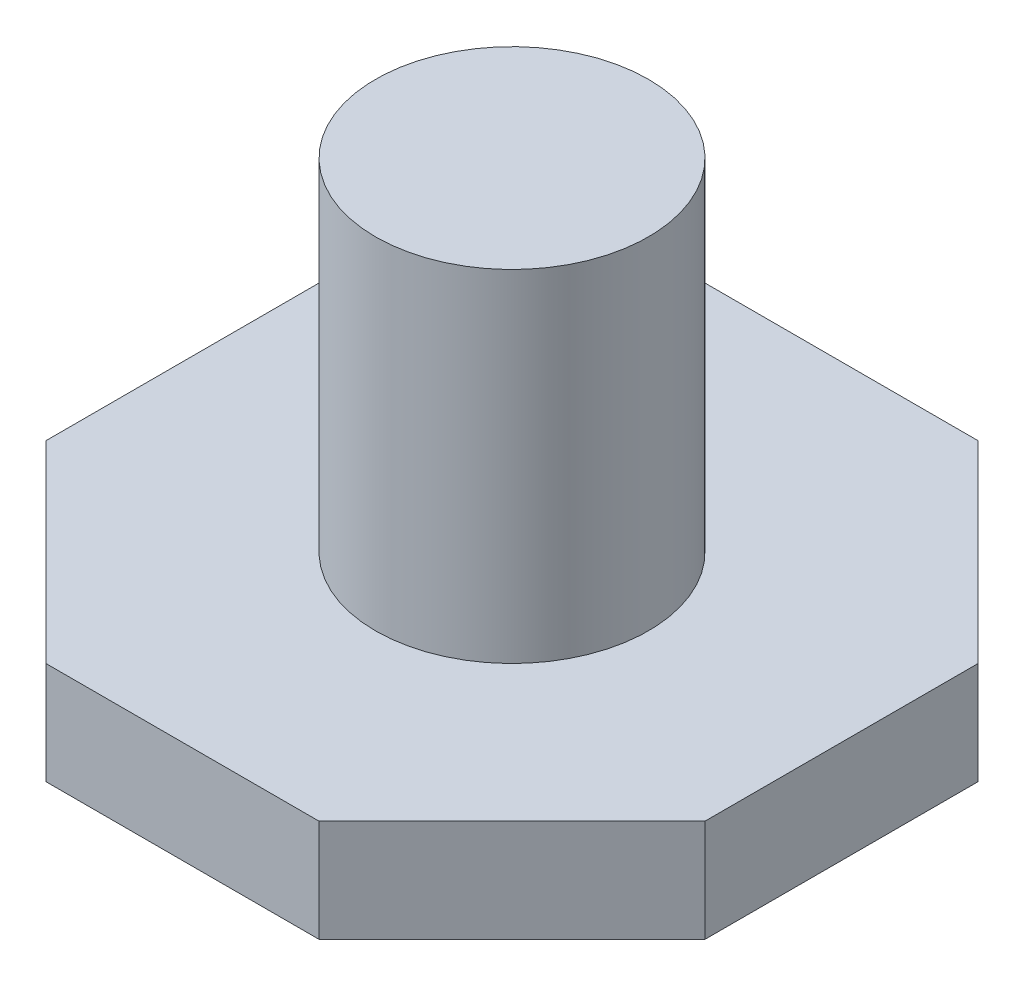
ISO-10303-21;
HEADER;
FILE_DESCRIPTION(('STEP AP214'),'2;1');
FILE_NAME('part.step','',(''),(''),'','','');
FILE_SCHEMA(('AUTOMOTIVE_DESIGN { 1 0 10303 214 1 1 1 1 }'));
ENDSEC;
DATA;
#1=APPLICATION_CONTEXT('core data for automotive mechanical design processes');
#2=APPLICATION_PROTOCOL_DEFINITION('international standard','automotive_design',2000,#1);
#3=PRODUCT_CONTEXT('',#1,'mechanical');
#4=PRODUCT('Part','Part','',(#3));
#5=PRODUCT_RELATED_PRODUCT_CATEGORY('part','',(#4));
#6=PRODUCT_DEFINITION_FORMATION('','',#4);
#7=PRODUCT_DEFINITION_CONTEXT('part definition',#1,'design');
#8=PRODUCT_DEFINITION('design','',#6,#7);
#9=PRODUCT_DEFINITION_SHAPE('','',#8);
#10=(LENGTH_UNIT() NAMED_UNIT(*) SI_UNIT(.MILLI.,.METRE.));
#11=(NAMED_UNIT(*) PLANE_ANGLE_UNIT() SI_UNIT($,.RADIAN.));
#12=(NAMED_UNIT(*) SI_UNIT($,.STERADIAN.) SOLID_ANGLE_UNIT());
#13=UNCERTAINTY_MEASURE_WITH_UNIT(LENGTH_MEASURE(1.E-05),#10,'distance_accuracy_value','');
#14=(GEOMETRIC_REPRESENTATION_CONTEXT(3) GLOBAL_UNCERTAINTY_ASSIGNED_CONTEXT((#13)) GLOBAL_UNIT_ASSIGNED_CONTEXT((#10,
#11,#12)) REPRESENTATION_CONTEXT('',''));
#15=CARTESIAN_POINT('',(0.,0.,0.));
#16=DIRECTION('',(0.,0.,1.));
#17=DIRECTION('',(1.,0.,0.));
#18=AXIS2_PLACEMENT_3D('',#15,#16,#17);
#19=CARTESIAN_POINT('',(4.82842712474619,-1.5,0.));
#20=DIRECTION('',(1.,0.,0.));
#21=DIRECTION('',(0.,0.,-1.));
#22=AXIS2_PLACEMENT_3D('',#19,#20,#21);
#23=PLANE('',#22);
#24=DIRECTION('',(0.,0.,-1.));
#25=VECTOR('',#24,1.);
#26=CARTESIAN_POINT('',(4.82842712474619,0.,0.));
#27=LINE('',#26,#25);
#28=CARTESIAN_POINT('',(4.82842712474619,0.,2.));
#29=VERTEX_POINT('',#28);
#30=CARTESIAN_POINT('',(4.82842712474619,0.,-2.));
#31=VERTEX_POINT('',#30);
#32=EDGE_CURVE('E134',#29,#31,#27,.T.);
#33=ORIENTED_EDGE('',*,*,#32,.F.);
#34=DIRECTION('',(0.,1.,0.));
#35=VECTOR('',#34,1.);
#36=CARTESIAN_POINT('',(4.82842712474619,-1.5,2.));
#37=LINE('',#36,#35);
#38=CARTESIAN_POINT('',(4.82842712474619,-1.5,2.));
#39=VERTEX_POINT('',#38);
#40=EDGE_CURVE('E44',#39,#29,#37,.T.);
#41=ORIENTED_EDGE('',*,*,#40,.F.);
#42=DIRECTION('',(0.,0.,-1.));
#43=VECTOR('',#42,1.);
#44=CARTESIAN_POINT('',(4.82842712474619,-1.5,0.));
#45=LINE('',#44,#43);
#46=CARTESIAN_POINT('',(4.82842712474619,-1.5,-2.));
#47=VERTEX_POINT('',#46);
#48=EDGE_CURVE('E156',#39,#47,#45,.T.);
#49=ORIENTED_EDGE('',*,*,#48,.T.);
#50=DIRECTION('',(0.,1.,0.));
#51=VECTOR('',#50,1.);
#52=CARTESIAN_POINT('',(4.82842712474619,-1.5,-2.));
#53=LINE('',#52,#51);
#54=EDGE_CURVE('E38',#47,#31,#53,.T.);
#55=ORIENTED_EDGE('',*,*,#54,.T.);
#56=EDGE_LOOP('',(#33,#41,#49,#55));
#57=FACE_BOUND('',#56,.T.);
#58=ADVANCED_FACE('F35',(#57),#23,.T.);
#59=CARTESIAN_POINT('',(3.4142135623731,-1.5,3.4142135623731));
#60=DIRECTION('',(0.707106781186547,0.,0.707106781186548));
#61=DIRECTION('',(0.707106781186548,0.,-0.707106781186547));
#62=AXIS2_PLACEMENT_3D('',#59,#60,#61);
#63=PLANE('',#62);
#64=DIRECTION('',(0.707106781186548,0.,-0.707106781186547));
#65=VECTOR('',#64,1.);
#66=CARTESIAN_POINT('',(3.4142135623731,0.,3.4142135623731));
#67=LINE('',#66,#65);
#68=CARTESIAN_POINT('',(2.,0.,4.82842712474619));
#69=VERTEX_POINT('',#68);
#70=EDGE_CURVE('E153',#69,#29,#67,.T.);
#71=ORIENTED_EDGE('',*,*,#70,.F.);
#72=DIRECTION('',(0.,1.,0.));
#73=VECTOR('',#72,1.);
#74=CARTESIAN_POINT('',(2.,-1.5,4.82842712474619));
#75=LINE('',#74,#73);
#76=CARTESIAN_POINT('',(2.,-1.5,4.82842712474619));
#77=VERTEX_POINT('',#76);
#78=EDGE_CURVE('E81',#77,#69,#75,.T.);
#79=ORIENTED_EDGE('',*,*,#78,.F.);
#80=DIRECTION('',(0.707106781186548,0.,-0.707106781186547));
#81=VECTOR('',#80,1.);
#82=CARTESIAN_POINT('',(3.4142135623731,-1.5,3.4142135623731));
#83=LINE('',#82,#81);
#84=EDGE_CURVE('E124',#77,#39,#83,.T.);
#85=ORIENTED_EDGE('',*,*,#84,.T.);
#86=ORIENTED_EDGE('',*,*,#40,.T.);
#87=EDGE_LOOP('',(#71,#79,#85,#86));
#88=FACE_BOUND('',#87,.T.);
#89=ADVANCED_FACE('F168',(#88),#63,.T.);
#90=CARTESIAN_POINT('',(0.,-1.5,4.82842712474619));
#91=DIRECTION('',(0.,0.,1.));
#92=DIRECTION('',(1.,0.,0.));
#93=AXIS2_PLACEMENT_3D('',#90,#91,#92);
#94=PLANE('',#93);
#95=DIRECTION('',(1.,0.,0.));
#96=VECTOR('',#95,1.);
#97=CARTESIAN_POINT('',(0.,0.,4.82842712474619));
#98=LINE('',#97,#96);
#99=CARTESIAN_POINT('',(-2.,0.,4.82842712474619));
#100=VERTEX_POINT('',#99);
#101=EDGE_CURVE('E111',#100,#69,#98,.T.);
#102=ORIENTED_EDGE('',*,*,#101,.F.);
#103=DIRECTION('',(0.,1.,0.));
#104=VECTOR('',#103,1.);
#105=CARTESIAN_POINT('',(-2.,-1.5,4.82842712474619));
#106=LINE('',#105,#104);
#107=CARTESIAN_POINT('',(-2.,-1.5,4.82842712474619));
#108=VERTEX_POINT('',#107);
#109=EDGE_CURVE('E106',#108,#100,#106,.T.);
#110=ORIENTED_EDGE('',*,*,#109,.F.);
#111=DIRECTION('',(1.,0.,0.));
#112=VECTOR('',#111,1.);
#113=CARTESIAN_POINT('',(0.,-1.5,4.82842712474619));
#114=LINE('',#113,#112);
#115=EDGE_CURVE('E109',#108,#77,#114,.T.);
#116=ORIENTED_EDGE('',*,*,#115,.T.);
#117=ORIENTED_EDGE('',*,*,#78,.T.);
#118=EDGE_LOOP('',(#102,#110,#116,#117));
#119=FACE_BOUND('',#118,.T.);
#120=ADVANCED_FACE('F108',(#119),#94,.T.);
#121=CARTESIAN_POINT('',(-3.4142135623731,-1.5,3.41421356237309));
#122=DIRECTION('',(-0.707106781186548,0.,0.707106781186547));
#123=DIRECTION('',(0.707106781186547,0.,0.707106781186548));
#124=AXIS2_PLACEMENT_3D('',#121,#122,#123);
#125=PLANE('',#124);
#126=DIRECTION('',(0.707106781186547,0.,0.707106781186548));
#127=VECTOR('',#126,1.);
#128=CARTESIAN_POINT('',(-3.4142135623731,0.,3.41421356237309));
#129=LINE('',#128,#127);
#130=CARTESIAN_POINT('',(-4.82842712474619,0.,2.));
#131=VERTEX_POINT('',#130);
#132=EDGE_CURVE('E150',#131,#100,#129,.T.);
#133=ORIENTED_EDGE('',*,*,#132,.F.);
#134=DIRECTION('',(0.,1.,0.));
#135=VECTOR('',#134,1.);
#136=CARTESIAN_POINT('',(-4.82842712474619,-1.5,2.));
#137=LINE('',#136,#135);
#138=CARTESIAN_POINT('',(-4.82842712474619,-1.5,2.));
#139=VERTEX_POINT('',#138);
#140=EDGE_CURVE('E116',#139,#131,#137,.T.);
#141=ORIENTED_EDGE('',*,*,#140,.F.);
#142=DIRECTION('',(0.707106781186547,0.,0.707106781186548));
#143=VECTOR('',#142,1.);
#144=CARTESIAN_POINT('',(-3.4142135623731,-1.5,3.41421356237309));
#145=LINE('',#144,#143);
#146=EDGE_CURVE('E122',#139,#108,#145,.T.);
#147=ORIENTED_EDGE('',*,*,#146,.T.);
#148=ORIENTED_EDGE('',*,*,#109,.T.);
#149=EDGE_LOOP('',(#133,#141,#147,#148));
#150=FACE_BOUND('',#149,.T.);
#151=ADVANCED_FACE('F126',(#150),#125,.T.);
#152=CARTESIAN_POINT('',(-4.82842712474619,-1.5,0.));
#153=DIRECTION('',(-1.,0.,0.));
#154=DIRECTION('',(0.,0.,1.));
#155=AXIS2_PLACEMENT_3D('',#152,#153,#154);
#156=PLANE('',#155);
#157=DIRECTION('',(0.,0.,1.));
#158=VECTOR('',#157,1.);
#159=CARTESIAN_POINT('',(-4.82842712474619,0.,0.));
#160=LINE('',#159,#158);
#161=CARTESIAN_POINT('',(-4.82842712474619,0.,-2.));
#162=VERTEX_POINT('',#161);
#163=EDGE_CURVE('E147',#162,#131,#160,.T.);
#164=ORIENTED_EDGE('',*,*,#163,.F.);
#165=DIRECTION('',(0.,1.,0.));
#166=VECTOR('',#165,1.);
#167=CARTESIAN_POINT('',(-4.82842712474619,-1.5,-2.));
#168=LINE('',#167,#166);
#169=CARTESIAN_POINT('',(-4.82842712474619,-1.5,-2.));
#170=VERTEX_POINT('',#169);
#171=EDGE_CURVE('E160',#170,#162,#168,.T.);
#172=ORIENTED_EDGE('',*,*,#171,.F.);
#173=DIRECTION('',(0.,0.,1.));
#174=VECTOR('',#173,1.);
#175=CARTESIAN_POINT('',(-4.82842712474619,-1.5,0.));
#176=LINE('',#175,#174);
#177=EDGE_CURVE('E127',#170,#139,#176,.T.);
#178=ORIENTED_EDGE('',*,*,#177,.T.);
#179=ORIENTED_EDGE('',*,*,#140,.T.);
#180=EDGE_LOOP('',(#164,#172,#178,#179));
#181=FACE_BOUND('',#180,.T.);
#182=ADVANCED_FACE('F181',(#181),#156,.T.);
#183=CARTESIAN_POINT('',(-3.41421356237309,-1.5,-3.41421356237309));
#184=DIRECTION('',(-0.707106781186547,0.,-0.707106781186548));
#185=DIRECTION('',(-0.707106781186548,0.,0.707106781186547));
#186=AXIS2_PLACEMENT_3D('',#183,#184,#185);
#187=PLANE('',#186);
#188=DIRECTION('',(-0.707106781186548,0.,0.707106781186547));
#189=VECTOR('',#188,1.);
#190=CARTESIAN_POINT('',(-3.41421356237309,0.,-3.41421356237309));
#191=LINE('',#190,#189);
#192=CARTESIAN_POINT('',(-2.,0.,-4.82842712474619));
#193=VERTEX_POINT('',#192);
#194=EDGE_CURVE('E144',#193,#162,#191,.T.);
#195=ORIENTED_EDGE('',*,*,#194,.F.);
#196=DIRECTION('',(0.,1.,0.));
#197=VECTOR('',#196,1.);
#198=CARTESIAN_POINT('',(-2.,-1.5,-4.82842712474619));
#199=LINE('',#198,#197);
#200=CARTESIAN_POINT('',(-2.,-1.5,-4.82842712474619));
#201=VERTEX_POINT('',#200);
#202=EDGE_CURVE('E162',#201,#193,#199,.T.);
#203=ORIENTED_EDGE('',*,*,#202,.F.);
#204=DIRECTION('',(-0.707106781186548,0.,0.707106781186547));
#205=VECTOR('',#204,1.);
#206=CARTESIAN_POINT('',(-3.41421356237309,-1.5,-3.41421356237309));
#207=LINE('',#206,#205);
#208=EDGE_CURVE('E129',#201,#170,#207,.T.);
#209=ORIENTED_EDGE('',*,*,#208,.T.);
#210=ORIENTED_EDGE('',*,*,#171,.T.);
#211=EDGE_LOOP('',(#195,#203,#209,#210));
#212=FACE_BOUND('',#211,.T.);
#213=ADVANCED_FACE('F184',(#212),#187,.T.);
#214=CARTESIAN_POINT('',(0.,-1.5,-4.82842712474619));
#215=DIRECTION('',(0.,0.,-1.));
#216=DIRECTION('',(-1.,0.,0.));
#217=AXIS2_PLACEMENT_3D('',#214,#215,#216);
#218=PLANE('',#217);
#219=DIRECTION('',(-1.,0.,0.));
#220=VECTOR('',#219,1.);
#221=CARTESIAN_POINT('',(0.,0.,-4.82842712474619));
#222=LINE('',#221,#220);
#223=CARTESIAN_POINT('',(2.,0.,-4.82842712474619));
#224=VERTEX_POINT('',#223);
#225=EDGE_CURVE('E141',#224,#193,#222,.T.);
#226=ORIENTED_EDGE('',*,*,#225,.F.);
#227=DIRECTION('',(0.,1.,0.));
#228=VECTOR('',#227,1.);
#229=CARTESIAN_POINT('',(2.,-1.5,-4.82842712474619));
#230=LINE('',#229,#228);
#231=CARTESIAN_POINT('',(2.,-1.5,-4.82842712474619));
#232=VERTEX_POINT('',#231);
#233=EDGE_CURVE('E163',#232,#224,#230,.T.);
#234=ORIENTED_EDGE('',*,*,#233,.F.);
#235=DIRECTION('',(-1.,0.,0.));
#236=VECTOR('',#235,1.);
#237=CARTESIAN_POINT('',(0.,-1.5,-4.82842712474619));
#238=LINE('',#237,#236);
#239=EDGE_CURVE('E217',#232,#201,#238,.T.);
#240=ORIENTED_EDGE('',*,*,#239,.T.);
#241=ORIENTED_EDGE('',*,*,#202,.T.);
#242=EDGE_LOOP('',(#226,#234,#240,#241));
#243=FACE_BOUND('',#242,.T.);
#244=ADVANCED_FACE('F188',(#243),#218,.T.);
#245=CARTESIAN_POINT('',(3.4142135623731,-1.5,-3.41421356237309));
#246=DIRECTION('',(0.707106781186548,0.,-0.707106781186547));
#247=DIRECTION('',(-0.707106781186547,0.,-0.707106781186548));
#248=AXIS2_PLACEMENT_3D('',#245,#246,#247);
#249=PLANE('',#248);
#250=DIRECTION('',(-0.707106781186547,0.,-0.707106781186548));
#251=VECTOR('',#250,1.);
#252=CARTESIAN_POINT('',(3.4142135623731,0.,-3.41421356237309));
#253=LINE('',#252,#251);
#254=EDGE_CURVE('E137',#31,#224,#253,.T.);
#255=ORIENTED_EDGE('',*,*,#254,.F.);
#256=ORIENTED_EDGE('',*,*,#54,.F.);
#257=DIRECTION('',(-0.707106781186547,0.,-0.707106781186548));
#258=VECTOR('',#257,1.);
#259=CARTESIAN_POINT('',(3.4142135623731,-1.5,-3.41421356237309));
#260=LINE('',#259,#258);
#261=EDGE_CURVE('E215',#47,#232,#260,.T.);
#262=ORIENTED_EDGE('',*,*,#261,.T.);
#263=ORIENTED_EDGE('',*,*,#233,.T.);
#264=EDGE_LOOP('',(#255,#256,#262,#263));
#265=FACE_BOUND('',#264,.T.);
#266=ADVANCED_FACE('F165',(#265),#249,.T.);
#267=CARTESIAN_POINT('',(0.,-1.5,0.));
#268=DIRECTION('',(0.,1.,0.));
#269=DIRECTION('',(0.,0.,1.));
#270=AXIS2_PLACEMENT_3D('',#267,#268,#269);
#271=PLANE('',#270);
#272=ORIENTED_EDGE('',*,*,#48,.F.);
#273=ORIENTED_EDGE('',*,*,#84,.F.);
#274=ORIENTED_EDGE('',*,*,#115,.F.);
#275=ORIENTED_EDGE('',*,*,#146,.F.);
#276=ORIENTED_EDGE('',*,*,#177,.F.);
#277=ORIENTED_EDGE('',*,*,#208,.F.);
#278=ORIENTED_EDGE('',*,*,#239,.F.);
#279=ORIENTED_EDGE('',*,*,#261,.F.);
#280=EDGE_LOOP('',(#272,#273,#274,#275,#276,#277,#278,#279));
#281=FACE_BOUND('',#280,.T.);
#282=ADVANCED_FACE('F120',(#281),#271,.F.);
#283=CARTESIAN_POINT('',(0.,0.,0.));
#284=DIRECTION('',(0.,1.,0.));
#285=DIRECTION('',(0.,0.,1.));
#286=AXIS2_PLACEMENT_3D('',#283,#284,#285);
#287=PLANE('',#286);
#288=CARTESIAN_POINT('',(0.,0.,0.));
#289=DIRECTION('',(0.,1.,0.));
#290=DIRECTION('',(0.,0.,1.));
#291=AXIS2_PLACEMENT_3D('',#288,#289,#290);
#292=CIRCLE('',#291,2.);
#293=CARTESIAN_POINT('',(0.,0.,2.));
#294=VERTEX_POINT('',#293);
#295=EDGE_CURVE('E11',#294,#294,#292,.T.);
#296=ORIENTED_EDGE('',*,*,#295,.F.);
#297=EDGE_LOOP('',(#296));
#298=FACE_BOUND('',#297,.T.);
#299=ORIENTED_EDGE('',*,*,#32,.T.);
#300=ORIENTED_EDGE('',*,*,#254,.T.);
#301=ORIENTED_EDGE('',*,*,#225,.T.);
#302=ORIENTED_EDGE('',*,*,#194,.T.);
#303=ORIENTED_EDGE('',*,*,#163,.T.);
#304=ORIENTED_EDGE('',*,*,#132,.T.);
#305=ORIENTED_EDGE('',*,*,#101,.T.);
#306=ORIENTED_EDGE('',*,*,#70,.T.);
#307=EDGE_LOOP('',(#299,#300,#301,#302,#303,#304,#305,#306));
#308=FACE_BOUND('',#307,.T.);
#309=ADVANCED_FACE('F167',(#298,#308),#287,.T.);
#310=CARTESIAN_POINT('',(0.,5.,0.));
#311=DIRECTION('',(0.,-1.,0.));
#312=DIRECTION('',(0.,0.,-1.));
#313=AXIS2_PLACEMENT_3D('',#310,#311,#312);
#314=CYLINDRICAL_SURFACE('',#313,2.);
#315=CARTESIAN_POINT('',(0.,5.,0.));
#316=DIRECTION('',(0.,1.,0.));
#317=DIRECTION('',(0.,0.,1.));
#318=AXIS2_PLACEMENT_3D('',#315,#316,#317);
#319=CIRCLE('',#318,2.);
#320=CARTESIAN_POINT('',(0.,5.,2.));
#321=VERTEX_POINT('',#320);
#322=EDGE_CURVE('E138',#321,#321,#319,.T.);
#323=ORIENTED_EDGE('',*,*,#322,.F.);
#324=EDGE_LOOP('',(#323));
#325=FACE_BOUND('',#324,.T.);
#326=ORIENTED_EDGE('',*,*,#295,.T.);
#327=EDGE_LOOP('',(#326));
#328=FACE_BOUND('',#327,.T.);
#329=ADVANCED_FACE('F199',(#325,#328),#314,.T.);
#330=CARTESIAN_POINT('',(0.,5.,0.));
#331=DIRECTION('',(0.,1.,0.));
#332=DIRECTION('',(0.,0.,1.));
#333=AXIS2_PLACEMENT_3D('',#330,#331,#332);
#334=PLANE('',#333);
#335=ORIENTED_EDGE('',*,*,#322,.T.);
#336=EDGE_LOOP('',(#335));
#337=FACE_BOUND('',#336,.T.);
#338=ADVANCED_FACE('F204',(#337),#334,.T.);
#339=CLOSED_SHELL('',(#58,#89,#120,#151,#182,#213,#244,#266,#282,#309,#329,#338));
#340=MANIFOLD_SOLID_BREP('B2',#339);
#341=ADVANCED_BREP_SHAPE_REPRESENTATION('',(#18,#340),#14);
#342=SHAPE_DEFINITION_REPRESENTATION(#9,#341);
ENDSEC;
END-ISO-10303-21;
